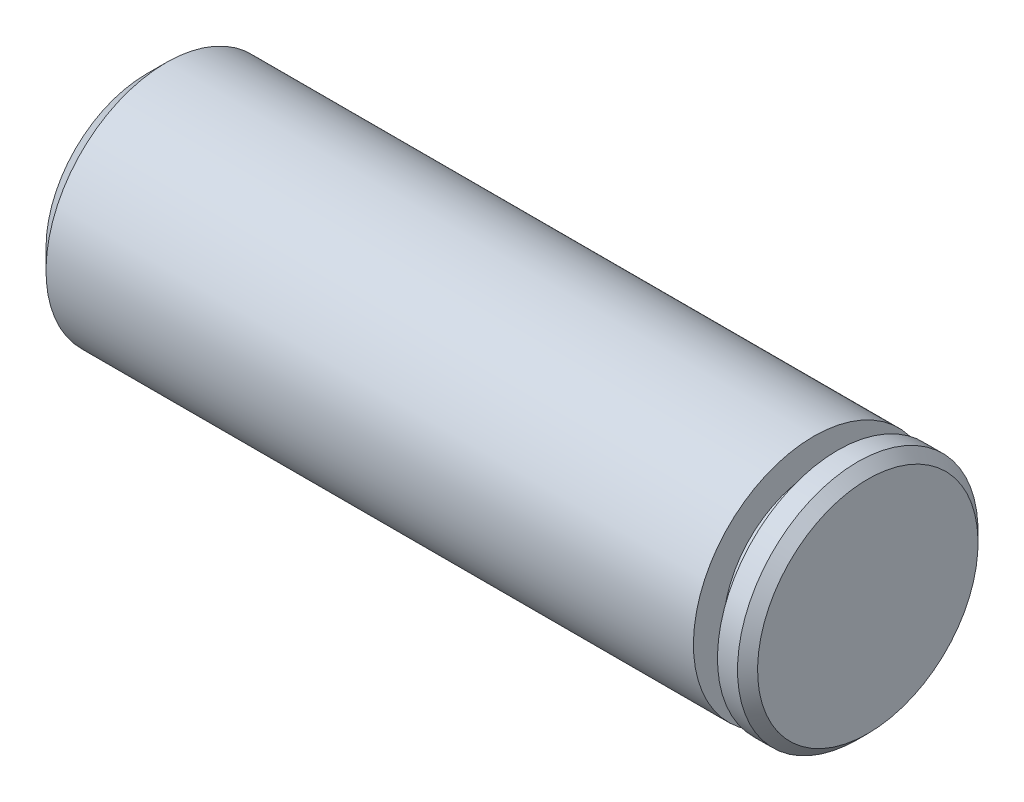
ISO-10303-21;
HEADER;
FILE_DESCRIPTION(('STEP AP214'),'2;1');
FILE_NAME('part.step','',(''),(''),'','','');
FILE_SCHEMA(('AUTOMOTIVE_DESIGN { 1 0 10303 214 1 1 1 1 }'));
ENDSEC;
DATA;
#1=APPLICATION_CONTEXT('core data for automotive mechanical design processes');
#2=APPLICATION_PROTOCOL_DEFINITION('international standard','automotive_design',2000,#1);
#3=PRODUCT_CONTEXT('',#1,'mechanical');
#4=PRODUCT('Part','Part','',(#3));
#5=PRODUCT_RELATED_PRODUCT_CATEGORY('part','',(#4));
#6=PRODUCT_DEFINITION_FORMATION('','',#4);
#7=PRODUCT_DEFINITION_CONTEXT('part definition',#1,'design');
#8=PRODUCT_DEFINITION('design','',#6,#7);
#9=PRODUCT_DEFINITION_SHAPE('','',#8);
#10=(LENGTH_UNIT() NAMED_UNIT(*) SI_UNIT(.MILLI.,.METRE.));
#11=(NAMED_UNIT(*) PLANE_ANGLE_UNIT() SI_UNIT($,.RADIAN.));
#12=(NAMED_UNIT(*) SI_UNIT($,.STERADIAN.) SOLID_ANGLE_UNIT());
#13=UNCERTAINTY_MEASURE_WITH_UNIT(LENGTH_MEASURE(1.E-05),#10,'distance_accuracy_value','');
#14=(GEOMETRIC_REPRESENTATION_CONTEXT(3) GLOBAL_UNCERTAINTY_ASSIGNED_CONTEXT((#13)) GLOBAL_UNIT_ASSIGNED_CONTEXT((#10,
#11,#12)) REPRESENTATION_CONTEXT('',''));
#15=CARTESIAN_POINT('',(0.,0.,0.));
#16=DIRECTION('',(0.,0.,1.));
#17=DIRECTION('',(1.,0.,0.));
#18=AXIS2_PLACEMENT_3D('',#15,#16,#17);
#19=CARTESIAN_POINT('',(0.,3.,0.));
#20=DIRECTION('',(1.,0.,0.));
#21=DIRECTION('',(0.,0.,-1.));
#22=AXIS2_PLACEMENT_3D('',#19,#20,#21);
#23=PLANE('',#22);
#24=CARTESIAN_POINT('',(-5.6841684137332E-11,0.,0.));
#25=DIRECTION('',(-1.,0.,0.));
#26=DIRECTION('',(0.,-1.,0.));
#27=AXIS2_PLACEMENT_3D('',#24,#25,#26);
#28=CIRCLE('',#27,5.50000000004047);
#29=CARTESIAN_POINT('',(-5.68399945889465E-11,-5.50000000004047,0.));
#30=VERTEX_POINT('',#29);
#31=EDGE_CURVE('E19',#30,#30,#28,.T.);
#32=ORIENTED_EDGE('',*,*,#31,.F.);
#33=EDGE_LOOP('',(#32));
#34=FACE_BOUND('',#33,.T.);
#35=ADVANCED_FACE('F15',(#34),#23,.T.);
#36=CARTESIAN_POINT('',(-0.499999999988178,0.,0.));
#37=DIRECTION('',(-1.,0.,0.));
#38=DIRECTION('',(0.,-1.,0.));
#39=AXIS2_PLACEMENT_3D('',#36,#37,#38);
#40=CONICAL_SURFACE('',#39,5.99999999991496,0.785398163340605);
#41=CARTESIAN_POINT('',(-0.499999999999998,0.,0.));
#42=DIRECTION('',(1.,0.,0.));
#43=DIRECTION('',(0.,1.,0.));
#44=AXIS2_PLACEMENT_3D('',#41,#42,#43);
#45=CIRCLE('',#44,6.);
#46=CARTESIAN_POINT('',(-0.5,6.,0.));
#47=VERTEX_POINT('',#46);
#48=EDGE_CURVE('E31',#47,#47,#45,.F.);
#49=ORIENTED_EDGE('',*,*,#48,.F.);
#50=EDGE_LOOP('',(#49));
#51=FACE_BOUND('',#50,.T.);
#52=ORIENTED_EDGE('',*,*,#31,.T.);
#53=EDGE_LOOP('',(#52));
#54=FACE_BOUND('',#53,.T.);
#55=ADVANCED_FACE('F49',(#51,#54),#40,.T.);
#56=CARTESIAN_POINT('',(-0.749999999999998,0.,0.));
#57=DIRECTION('',(1.,0.,0.));
#58=DIRECTION('',(0.,1.,0.));
#59=AXIS2_PLACEMENT_3D('',#56,#57,#58);
#60=CYLINDRICAL_SURFACE('',#59,6.);
#61=ORIENTED_EDGE('',*,*,#48,.T.);
#62=EDGE_LOOP('',(#61));
#63=FACE_BOUND('',#62,.T.);
#64=CARTESIAN_POINT('',(-1.5,0.,0.));
#65=DIRECTION('',(1.,0.,0.));
#66=DIRECTION('',(0.,1.,0.));
#67=AXIS2_PLACEMENT_3D('',#64,#65,#66);
#68=CIRCLE('',#67,6.);
#69=CARTESIAN_POINT('',(-1.5,6.,0.));
#70=VERTEX_POINT('',#69);
#71=EDGE_CURVE('E33',#70,#70,#68,.F.);
#72=ORIENTED_EDGE('',*,*,#71,.F.);
#73=EDGE_LOOP('',(#72));
#74=FACE_BOUND('',#73,.T.);
#75=ADVANCED_FACE('F47',(#63,#74),#60,.T.);
#76=CARTESIAN_POINT('',(-1.5,5.25,0.));
#77=DIRECTION('',(-1.,0.,0.));
#78=DIRECTION('',(0.,-1.,0.));
#79=AXIS2_PLACEMENT_3D('',#76,#77,#78);
#80=PLANE('',#79);
#81=CARTESIAN_POINT('',(-1.5,0.,0.));
#82=DIRECTION('',(1.,0.,0.));
#83=DIRECTION('',(0.,1.,0.));
#84=AXIS2_PLACEMENT_3D('',#81,#82,#83);
#85=CIRCLE('',#84,4.5);
#86=CARTESIAN_POINT('',(-1.5,4.5,0.));
#87=VERTEX_POINT('',#86);
#88=EDGE_CURVE('E40',#87,#87,#85,.F.);
#89=ORIENTED_EDGE('',*,*,#88,.F.);
#90=EDGE_LOOP('',(#89));
#91=FACE_BOUND('',#90,.T.);
#92=ORIENTED_EDGE('',*,*,#71,.T.);
#93=EDGE_LOOP('',(#92));
#94=FACE_BOUND('',#93,.T.);
#95=ADVANCED_FACE('F45',(#91,#94),#80,.T.);
#96=CARTESIAN_POINT('',(-2.1,0.,0.));
#97=DIRECTION('',(1.,0.,0.));
#98=DIRECTION('',(0.,1.,0.));
#99=AXIS2_PLACEMENT_3D('',#96,#97,#98);
#100=CYLINDRICAL_SURFACE('',#99,4.5);
#101=ORIENTED_EDGE('',*,*,#88,.T.);
#102=EDGE_LOOP('',(#101));
#103=FACE_BOUND('',#102,.T.);
#104=CARTESIAN_POINT('',(-2.7,0.,0.));
#105=DIRECTION('',(1.,0.,0.));
#106=DIRECTION('',(0.,1.,0.));
#107=AXIS2_PLACEMENT_3D('',#104,#105,#106);
#108=CIRCLE('',#107,4.5);
#109=CARTESIAN_POINT('',(-2.7,4.5,0.));
#110=VERTEX_POINT('',#109);
#111=EDGE_CURVE('E37',#110,#110,#108,.F.);
#112=ORIENTED_EDGE('',*,*,#111,.F.);
#113=EDGE_LOOP('',(#112));
#114=FACE_BOUND('',#113,.T.);
#115=ADVANCED_FACE('F57',(#103,#114),#100,.T.);
#116=CARTESIAN_POINT('',(-36.,2.99999999999999,0.));
#117=DIRECTION('',(-1.,0.,0.));
#118=DIRECTION('',(0.,-1.,0.));
#119=AXIS2_PLACEMENT_3D('',#116,#117,#118);
#120=PLANE('',#119);
#121=CARTESIAN_POINT('',(-36.000000000013,0.,0.));
#122=DIRECTION('',(1.,0.,0.));
#123=DIRECTION('',(0.,1.,0.));
#124=AXIS2_PLACEMENT_3D('',#121,#122,#123);
#125=CIRCLE('',#124,4.99999999998385);
#126=CARTESIAN_POINT('',(-36.000000000013,4.99999999998384,0.));
#127=VERTEX_POINT('',#126);
#128=EDGE_CURVE('E28',#127,#127,#125,.T.);
#129=ORIENTED_EDGE('',*,*,#128,.F.);
#130=EDGE_LOOP('',(#129));
#131=FACE_BOUND('',#130,.T.);
#132=ADVANCED_FACE('F74',(#131),#120,.T.);
#133=CARTESIAN_POINT('',(-2.7,5.25,0.));
#134=DIRECTION('',(1.,0.,0.));
#135=DIRECTION('',(0.,0.,-1.));
#136=AXIS2_PLACEMENT_3D('',#133,#134,#135);
#137=PLANE('',#136);
#138=CARTESIAN_POINT('',(-2.7,0.,0.));
#139=DIRECTION('',(1.,0.,0.));
#140=DIRECTION('',(0.,1.,0.));
#141=AXIS2_PLACEMENT_3D('',#138,#139,#140);
#142=CIRCLE('',#141,6.);
#143=CARTESIAN_POINT('',(-2.7,6.,0.));
#144=VERTEX_POINT('',#143);
#145=EDGE_CURVE('E23',#144,#144,#142,.F.);
#146=ORIENTED_EDGE('',*,*,#145,.F.);
#147=EDGE_LOOP('',(#146));
#148=FACE_BOUND('',#147,.T.);
#149=ORIENTED_EDGE('',*,*,#111,.T.);
#150=EDGE_LOOP('',(#149));
#151=FACE_BOUND('',#150,.T.);
#152=ADVANCED_FACE('F68',(#148,#151),#137,.T.);
#153=CARTESIAN_POINT('',(-34.9999999999682,0.,0.));
#154=DIRECTION('',(1.,0.,0.));
#155=DIRECTION('',(0.,1.,0.));
#156=AXIS2_PLACEMENT_3D('',#153,#154,#155);
#157=CONICAL_SURFACE('',#156,6.00000000002864,0.785398163397449);
#158=CARTESIAN_POINT('',(-35.,0.,0.));
#159=DIRECTION('',(1.,0.,0.));
#160=DIRECTION('',(0.,1.,0.));
#161=AXIS2_PLACEMENT_3D('',#158,#159,#160);
#162=CIRCLE('',#161,6.);
#163=CARTESIAN_POINT('',(-35.,5.99999999999999,0.));
#164=VERTEX_POINT('',#163);
#165=EDGE_CURVE('E10',#164,#164,#162,.T.);
#166=ORIENTED_EDGE('',*,*,#165,.F.);
#167=EDGE_LOOP('',(#166));
#168=FACE_BOUND('',#167,.T.);
#169=ORIENTED_EDGE('',*,*,#128,.T.);
#170=EDGE_LOOP('',(#169));
#171=FACE_BOUND('',#170,.T.);
#172=ADVANCED_FACE('F63',(#168,#171),#157,.T.);
#173=CARTESIAN_POINT('',(-19.35,0.,0.));
#174=DIRECTION('',(1.,0.,0.));
#175=DIRECTION('',(0.,1.,0.));
#176=AXIS2_PLACEMENT_3D('',#173,#174,#175);
#177=CYLINDRICAL_SURFACE('',#176,6.);
#178=ORIENTED_EDGE('',*,*,#145,.T.);
#179=EDGE_LOOP('',(#178));
#180=FACE_BOUND('',#179,.T.);
#181=ORIENTED_EDGE('',*,*,#165,.T.);
#182=EDGE_LOOP('',(#181));
#183=FACE_BOUND('',#182,.T.);
#184=ADVANCED_FACE('F17',(#180,#183),#177,.T.);
#185=CLOSED_SHELL('',(#35,#55,#75,#95,#115,#132,#152,#172,#184));
#186=MANIFOLD_SOLID_BREP('B1',#185);
#187=ADVANCED_BREP_SHAPE_REPRESENTATION('',(#18,#186),#14);
#188=SHAPE_DEFINITION_REPRESENTATION(#9,#187);
ENDSEC;
END-ISO-10303-21;
